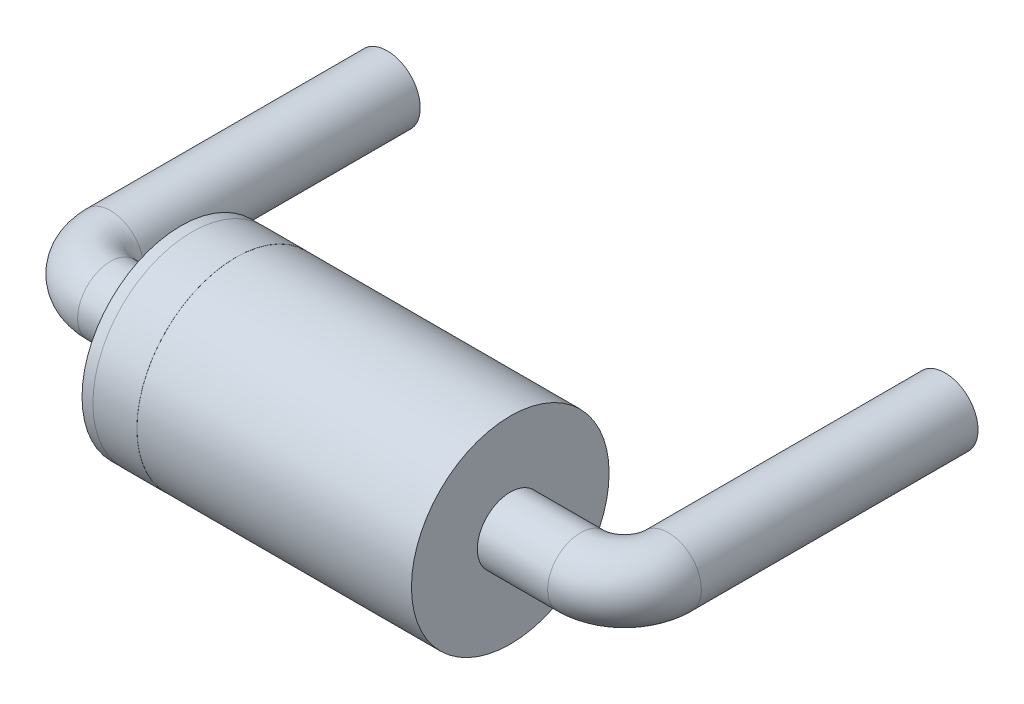
ISO-10303-21;
HEADER;
FILE_DESCRIPTION(('STEP AP214'),'2;1');
FILE_NAME('part.step','',(''),(''),'','','');
FILE_SCHEMA(('AUTOMOTIVE_DESIGN { 1 0 10303 214 1 1 1 1 }'));
ENDSEC;
DATA;
#1=APPLICATION_CONTEXT('core data for automotive mechanical design processes');
#2=APPLICATION_PROTOCOL_DEFINITION('international standard','automotive_design',2000,#1);
#3=PRODUCT_CONTEXT('',#1,'mechanical');
#4=PRODUCT('Part','Part','',(#3));
#5=PRODUCT_RELATED_PRODUCT_CATEGORY('part','',(#4));
#6=PRODUCT_DEFINITION_FORMATION('','',#4);
#7=PRODUCT_DEFINITION_CONTEXT('part definition',#1,'design');
#8=PRODUCT_DEFINITION('design','',#6,#7);
#9=PRODUCT_DEFINITION_SHAPE('','',#8);
#10=(LENGTH_UNIT() NAMED_UNIT(*) SI_UNIT(.MILLI.,.METRE.));
#11=(NAMED_UNIT(*) PLANE_ANGLE_UNIT() SI_UNIT($,.RADIAN.));
#12=(NAMED_UNIT(*) SI_UNIT($,.STERADIAN.) SOLID_ANGLE_UNIT());
#13=UNCERTAINTY_MEASURE_WITH_UNIT(LENGTH_MEASURE(1.E-05),#10,'distance_accuracy_value','');
#14=(GEOMETRIC_REPRESENTATION_CONTEXT(3) GLOBAL_UNCERTAINTY_ASSIGNED_CONTEXT((#13)) GLOBAL_UNIT_ASSIGNED_CONTEXT((#10,
#11,#12)) REPRESENTATION_CONTEXT('',''));
#15=CARTESIAN_POINT('',(0.,0.,0.));
#16=DIRECTION('',(0.,0.,1.));
#17=DIRECTION('',(1.,0.,0.));
#18=AXIS2_PLACEMENT_3D('',#15,#16,#17);
#19=CARTESIAN_POINT('',(1.5,0.,0.919999999999982));
#20=DIRECTION('',(1.,0.,0.));
#21=DIRECTION('',(0.,0.,-1.));
#22=AXIS2_PLACEMENT_3D('',#19,#20,#21);
#23=PLANE('',#22);
#24=CARTESIAN_POINT('',(1.5,0.,0.919999999999982));
#25=DIRECTION('',(1.,0.,0.));
#26=DIRECTION('',(0.,0.,-1.));
#27=AXIS2_PLACEMENT_3D('',#24,#25,#26);
#28=CIRCLE('',#27,0.90000000000001);
#29=CARTESIAN_POINT('',(1.5,0.,0.0199999999999711));
#30=VERTEX_POINT('',#29);
#31=EDGE_CURVE('E89',#30,#30,#28,.T.);
#32=ORIENTED_EDGE('',*,*,#31,.T.);
#33=EDGE_LOOP('',(#32));
#34=FACE_BOUND('',#33,.T.);
#35=CARTESIAN_POINT('',(1.5,0.,0.919999999999982));
#36=DIRECTION('',(1.,0.,0.));
#37=DIRECTION('',(0.,0.,-1.));
#38=AXIS2_PLACEMENT_3D('',#35,#36,#37);
#39=CIRCLE('',#38,0.3);
#40=CARTESIAN_POINT('',(1.5,0.,0.619999999999982));
#41=VERTEX_POINT('',#40);
#42=EDGE_CURVE('E66',#41,#41,#39,.T.);
#43=ORIENTED_EDGE('',*,*,#42,.F.);
#44=EDGE_LOOP('',(#43));
#45=FACE_BOUND('',#44,.T.);
#46=ADVANCED_FACE('F43',(#34,#45),#23,.T.);
#47=CARTESIAN_POINT('',(-1.5,0.,0.919999999999982));
#48=DIRECTION('',(1.,0.,0.));
#49=DIRECTION('',(0.,0.,-1.));
#50=AXIS2_PLACEMENT_3D('',#47,#48,#49);
#51=CYLINDRICAL_SURFACE('',#50,0.90000000000001);
#52=CARTESIAN_POINT('',(-1.,0.,0.919999999999982));
#53=DIRECTION('',(1.,0.,0.));
#54=DIRECTION('',(0.,0.,-1.));
#55=AXIS2_PLACEMENT_3D('',#52,#53,#54);
#56=CIRCLE('',#55,0.90000000000001);
#57=CARTESIAN_POINT('',(-1.,0.,0.0199999999999711));
#58=VERTEX_POINT('',#57);
#59=EDGE_CURVE('E11',#58,#58,#56,.F.);
#60=ORIENTED_EDGE('',*,*,#59,.F.);
#61=EDGE_LOOP('',(#60));
#62=FACE_BOUND('',#61,.T.);
#63=ORIENTED_EDGE('',*,*,#31,.F.);
#64=EDGE_LOOP('',(#63));
#65=FACE_BOUND('',#64,.T.);
#66=ADVANCED_FACE('F115',(#62,#65),#51,.T.);
#67=CARTESIAN_POINT('',(2.53999999999999,0.,-2.00000000000002));
#68=DIRECTION('',(0.,0.,-1.));
#69=DIRECTION('',(-1.,0.,0.));
#70=AXIS2_PLACEMENT_3D('',#67,#68,#69);
#71=PLANE('',#70);
#72=CARTESIAN_POINT('',(2.53999999999999,0.,-2.00000000000002));
#73=DIRECTION('',(0.,0.,-1.));
#74=DIRECTION('',(-1.,0.,0.));
#75=AXIS2_PLACEMENT_3D('',#72,#73,#74);
#76=CIRCLE('',#75,0.3);
#77=CARTESIAN_POINT('',(2.23999999999999,0.,-2.00000000000002));
#78=VERTEX_POINT('',#77);
#79=EDGE_CURVE('E68',#78,#78,#76,.T.);
#80=ORIENTED_EDGE('',*,*,#79,.T.);
#81=EDGE_LOOP('',(#80));
#82=FACE_BOUND('',#81,.T.);
#83=ADVANCED_FACE('F125',(#82),#71,.T.);
#84=CARTESIAN_POINT('',(2.53999999999999,0.,0.519999999999987));
#85=DIRECTION('',(0.,0.,-1.));
#86=DIRECTION('',(-1.,0.,0.));
#87=AXIS2_PLACEMENT_3D('',#84,#85,#86);
#88=CYLINDRICAL_SURFACE('',#87,0.3);
#89=CARTESIAN_POINT('',(2.53999999999999,0.,0.519999999999987));
#90=DIRECTION('',(0.,0.,-1.));
#91=DIRECTION('',(-1.,0.,0.));
#92=AXIS2_PLACEMENT_3D('',#89,#90,#91);
#93=CIRCLE('',#92,0.3);
#94=CARTESIAN_POINT('',(2.83999999999999,0.,0.519999999999987));
#95=VERTEX_POINT('',#94);
#96=EDGE_CURVE('E82',#95,#95,#93,.T.);
#97=ORIENTED_EDGE('',*,*,#96,.T.);
#98=EDGE_LOOP('',(#97));
#99=FACE_BOUND('',#98,.T.);
#100=ORIENTED_EDGE('',*,*,#79,.F.);
#101=EDGE_LOOP('',(#100));
#102=FACE_BOUND('',#101,.T.);
#103=ADVANCED_FACE('F157',(#99,#102),#88,.T.);
#104=CARTESIAN_POINT('',(2.13999999999999,0.,0.519999999999987));
#105=DIRECTION('',(0.,-1.,0.));
#106=DIRECTION('',(0.,0.,-1.));
#107=AXIS2_PLACEMENT_3D('',#104,#105,#106);
#108=TOROIDAL_SURFACE('',#107,0.399999999999995,0.3);
#109=CARTESIAN_POINT('',(2.13999999999999,0.,0.919999999999982));
#110=DIRECTION('',(1.,0.,0.));
#111=DIRECTION('',(0.,0.,-1.));
#112=AXIS2_PLACEMENT_3D('',#109,#110,#111);
#113=CIRCLE('',#112,0.3);
#114=CARTESIAN_POINT('',(2.13999999999999,0.,1.21999999999998));
#115=VERTEX_POINT('',#114);
#116=EDGE_CURVE('E78',#115,#115,#113,.T.);
#117=CARTESIAN_POINT('',(2.13999999999999,0.,0.519999999999987));
#118=DIRECTION('',(0.,-1.,0.));
#119=DIRECTION('',(0.,0.,-1.));
#120=AXIS2_PLACEMENT_3D('',#117,#118,#119);
#121=CIRCLE('',#120,0.699999999999995);
#122=EDGE_CURVE('',#95,#115,#121,.T.);
#123=ORIENTED_EDGE('',*,*,#96,.F.);
#124=ORIENTED_EDGE('',*,*,#116,.T.);
#125=ORIENTED_EDGE('',*,*,#122,.T.);
#126=ORIENTED_EDGE('',*,*,#122,.F.);
#127=EDGE_LOOP('',(#123,#125,#124,#126));
#128=FACE_BOUND('',#127,.T.);
#129=ADVANCED_FACE('F148',(#128),#108,.T.);
#130=CARTESIAN_POINT('',(2.13999999999999,0.,0.919999999999982));
#131=DIRECTION('',(-1.,0.,0.));
#132=DIRECTION('',(0.,0.,1.));
#133=AXIS2_PLACEMENT_3D('',#130,#131,#132);
#134=CYLINDRICAL_SURFACE('',#133,0.3);
#135=ORIENTED_EDGE('',*,*,#42,.T.);
#136=EDGE_LOOP('',(#135));
#137=FACE_BOUND('',#136,.T.);
#138=ORIENTED_EDGE('',*,*,#116,.F.);
#139=EDGE_LOOP('',(#138));
#140=FACE_BOUND('',#139,.T.);
#141=ADVANCED_FACE('F143',(#137,#140),#134,.T.);
#142=CARTESIAN_POINT('',(-1.,0.,0.919999999999982));
#143=DIRECTION('',(1.,0.,0.));
#144=DIRECTION('',(0.,0.,-1.));
#145=AXIS2_PLACEMENT_3D('',#142,#143,#144);
#146=PLANE('',#145);
#147=CARTESIAN_POINT('',(-1.,0.,0.919999999999982));
#148=DIRECTION('',(1.,0.,0.));
#149=DIRECTION('',(0.,0.,-1.));
#150=AXIS2_PLACEMENT_3D('',#147,#148,#149);
#151=CIRCLE('',#150,0.901000000000011);
#152=CARTESIAN_POINT('',(-1.,0.,0.0189999999999711));
#153=VERTEX_POINT('',#152);
#154=EDGE_CURVE('E93',#153,#153,#151,.T.);
#155=ORIENTED_EDGE('',*,*,#154,.T.);
#156=EDGE_LOOP('',(#155));
#157=FACE_BOUND('',#156,.T.);
#158=ORIENTED_EDGE('',*,*,#59,.T.);
#159=EDGE_LOOP('',(#158));
#160=FACE_BOUND('',#159,.T.);
#161=ADVANCED_FACE('F140',(#157,#160),#146,.T.);
#162=CARTESIAN_POINT('',(-1.4,0.,0.919999999999982));
#163=DIRECTION('',(1.,0.,0.));
#164=DIRECTION('',(0.,0.,-1.));
#165=AXIS2_PLACEMENT_3D('',#162,#163,#164);
#166=PLANE('',#165);
#167=CARTESIAN_POINT('',(-1.4,0.,0.919999999999982));
#168=DIRECTION('',(1.,0.,0.));
#169=DIRECTION('',(0.,0.,-1.));
#170=AXIS2_PLACEMENT_3D('',#167,#168,#169);
#171=CIRCLE('',#170,0.901000000000011);
#172=CARTESIAN_POINT('',(-1.4,0.,0.0189999999999711));
#173=VERTEX_POINT('',#172);
#174=EDGE_CURVE('E96',#173,#173,#171,.T.);
#175=ORIENTED_EDGE('',*,*,#174,.F.);
#176=EDGE_LOOP('',(#175));
#177=FACE_BOUND('',#176,.T.);
#178=CARTESIAN_POINT('',(-1.4,0.,0.919999999999982));
#179=DIRECTION('',(1.,0.,0.));
#180=DIRECTION('',(0.,0.,-1.));
#181=AXIS2_PLACEMENT_3D('',#178,#179,#180);
#182=CIRCLE('',#181,0.90000000000001);
#183=CARTESIAN_POINT('',(-1.4,0.,0.0199999999999711));
#184=VERTEX_POINT('',#183);
#185=EDGE_CURVE('E100',#184,#184,#182,.T.);
#186=ORIENTED_EDGE('',*,*,#185,.T.);
#187=EDGE_LOOP('',(#186));
#188=FACE_BOUND('',#187,.T.);
#189=ADVANCED_FACE('F108',(#177,#188),#166,.F.);
#190=CARTESIAN_POINT('',(-1.,0.,0.919999999999982));
#191=DIRECTION('',(-1.,0.,0.));
#192=DIRECTION('',(0.,0.,1.));
#193=AXIS2_PLACEMENT_3D('',#190,#191,#192);
#194=CYLINDRICAL_SURFACE('',#193,0.901000000000011);
#195=ORIENTED_EDGE('',*,*,#154,.F.);
#196=EDGE_LOOP('',(#195));
#197=FACE_BOUND('',#196,.T.);
#198=ORIENTED_EDGE('',*,*,#174,.T.);
#199=EDGE_LOOP('',(#198));
#200=FACE_BOUND('',#199,.T.);
#201=ADVANCED_FACE('F133',(#197,#200),#194,.T.);
#202=CARTESIAN_POINT('',(-2.54000000000001,0.,-1.99999999999998));
#203=DIRECTION('',(0.,0.,1.));
#204=DIRECTION('',(1.,0.,0.));
#205=AXIS2_PLACEMENT_3D('',#202,#203,#204);
#206=PLANE('',#205);
#207=CARTESIAN_POINT('',(-2.54000000000001,0.,-1.99999999999998));
#208=DIRECTION('',(0.,0.,1.));
#209=DIRECTION('',(1.,0.,0.));
#210=AXIS2_PLACEMENT_3D('',#207,#208,#209);
#211=CIRCLE('',#210,0.3);
#212=CARTESIAN_POINT('',(-2.24000000000001,0.,-2.00000000000001));
#213=VERTEX_POINT('',#212);
#214=EDGE_CURVE('E57',#213,#213,#211,.T.);
#215=ORIENTED_EDGE('',*,*,#214,.F.);
#216=EDGE_LOOP('',(#215));
#217=FACE_BOUND('',#216,.T.);
#218=ADVANCED_FACE('F136',(#217),#206,.F.);
#219=CARTESIAN_POINT('',(-2.54000000000002,0.,0.520000000000022));
#220=DIRECTION('',(0.,0.,-1.));
#221=DIRECTION('',(-1.,0.,0.));
#222=AXIS2_PLACEMENT_3D('',#219,#220,#221);
#223=CYLINDRICAL_SURFACE('',#222,0.3);
#224=CARTESIAN_POINT('',(-2.54000000000002,0.,0.520000000000022));
#225=DIRECTION('',(0.,0.,1.));
#226=DIRECTION('',(1.,0.,0.));
#227=AXIS2_PLACEMENT_3D('',#224,#225,#226);
#228=CIRCLE('',#227,0.3);
#229=CARTESIAN_POINT('',(-2.84000000000002,0.,0.520000000000048));
#230=VERTEX_POINT('',#229);
#231=EDGE_CURVE('E63',#230,#230,#228,.T.);
#232=ORIENTED_EDGE('',*,*,#231,.F.);
#233=EDGE_LOOP('',(#232));
#234=FACE_BOUND('',#233,.T.);
#235=ORIENTED_EDGE('',*,*,#214,.T.);
#236=EDGE_LOOP('',(#235));
#237=FACE_BOUND('',#236,.T.);
#238=ADVANCED_FACE('F45',(#234,#237),#223,.T.);
#239=CARTESIAN_POINT('',(-2.14000000000002,0.,0.519999999999987));
#240=DIRECTION('',(0.,-1.,0.));
#241=DIRECTION('',(0.,0.,-1.));
#242=AXIS2_PLACEMENT_3D('',#239,#240,#241);
#243=TOROIDAL_SURFACE('',#242,0.399999999999997,0.3);
#244=CARTESIAN_POINT('',(-2.14000000000002,0.,0.919999999999985));
#245=DIRECTION('',(1.,0.,0.));
#246=DIRECTION('',(0.,0.,-1.));
#247=AXIS2_PLACEMENT_3D('',#244,#245,#246);
#248=CIRCLE('',#247,0.3);
#249=CARTESIAN_POINT('',(-2.14000000000002,0.,1.21999999999998));
#250=VERTEX_POINT('',#249);
#251=EDGE_CURVE('E74',#250,#250,#248,.T.);
#252=CARTESIAN_POINT('',(-2.14000000000002,0.,0.519999999999987));
#253=DIRECTION('',(0.,-1.,0.));
#254=DIRECTION('',(0.,0.,-1.));
#255=AXIS2_PLACEMENT_3D('',#252,#253,#254);
#256=CIRCLE('',#255,0.699999999999998);
#257=EDGE_CURVE('',#250,#230,#256,.T.);
#258=ORIENTED_EDGE('',*,*,#251,.F.);
#259=ORIENTED_EDGE('',*,*,#231,.T.);
#260=ORIENTED_EDGE('',*,*,#257,.T.);
#261=ORIENTED_EDGE('',*,*,#257,.F.);
#262=EDGE_LOOP('',(#258,#260,#259,#261));
#263=FACE_BOUND('',#262,.T.);
#264=ADVANCED_FACE('F162',(#263),#243,.T.);
#265=ORIENTED_EDGE('',*,*,#251,.T.);
#266=EDGE_LOOP('',(#265));
#267=FACE_BOUND('',#266,.T.);
#268=CARTESIAN_POINT('',(-1.5,0.,0.919999999999984));
#269=DIRECTION('',(1.,0.,0.));
#270=DIRECTION('',(0.,0.,-1.));
#271=AXIS2_PLACEMENT_3D('',#268,#269,#270);
#272=CIRCLE('',#271,0.3);
#273=CARTESIAN_POINT('',(-1.5,0.,0.619999999999984));
#274=VERTEX_POINT('',#273);
#275=EDGE_CURVE('E51',#274,#274,#272,.T.);
#276=ORIENTED_EDGE('',*,*,#275,.F.);
#277=EDGE_LOOP('',(#276));
#278=FACE_BOUND('',#277,.T.);
#279=ADVANCED_FACE('F119',(#267,#278),#134,.T.);
#280=CARTESIAN_POINT('',(-1.5,0.,0.919999999999982));
#281=DIRECTION('',(1.,0.,0.));
#282=DIRECTION('',(0.,0.,-1.));
#283=AXIS2_PLACEMENT_3D('',#280,#281,#282);
#284=PLANE('',#283);
#285=CARTESIAN_POINT('',(-1.5,0.,0.919999999999982));
#286=DIRECTION('',(1.,0.,0.));
#287=DIRECTION('',(0.,0.,-1.));
#288=AXIS2_PLACEMENT_3D('',#285,#286,#287);
#289=CIRCLE('',#288,0.90000000000001);
#290=CARTESIAN_POINT('',(-1.5,0.,0.0199999999999711));
#291=VERTEX_POINT('',#290);
#292=EDGE_CURVE('E69',#291,#291,#289,.T.);
#293=ORIENTED_EDGE('',*,*,#292,.F.);
#294=EDGE_LOOP('',(#293));
#295=FACE_BOUND('',#294,.T.);
#296=ORIENTED_EDGE('',*,*,#275,.T.);
#297=EDGE_LOOP('',(#296));
#298=FACE_BOUND('',#297,.T.);
#299=ADVANCED_FACE('F112',(#295,#298),#284,.F.);
#300=ORIENTED_EDGE('',*,*,#292,.T.);
#301=EDGE_LOOP('',(#300));
#302=FACE_BOUND('',#301,.T.);
#303=ORIENTED_EDGE('',*,*,#185,.F.);
#304=EDGE_LOOP('',(#303));
#305=FACE_BOUND('',#304,.T.);
#306=ADVANCED_FACE('F110',(#302,#305),#51,.T.);
#307=CLOSED_SHELL('',(#46,#66,#83,#103,#129,#141,#161,#189,#201,#218,#238,#264,#279,#299,#306));
#308=MANIFOLD_SOLID_BREP('B2',#307);
#309=ADVANCED_BREP_SHAPE_REPRESENTATION('',(#18,#308),#14);
#310=SHAPE_DEFINITION_REPRESENTATION(#9,#309);
ENDSEC;
END-ISO-10303-21;
